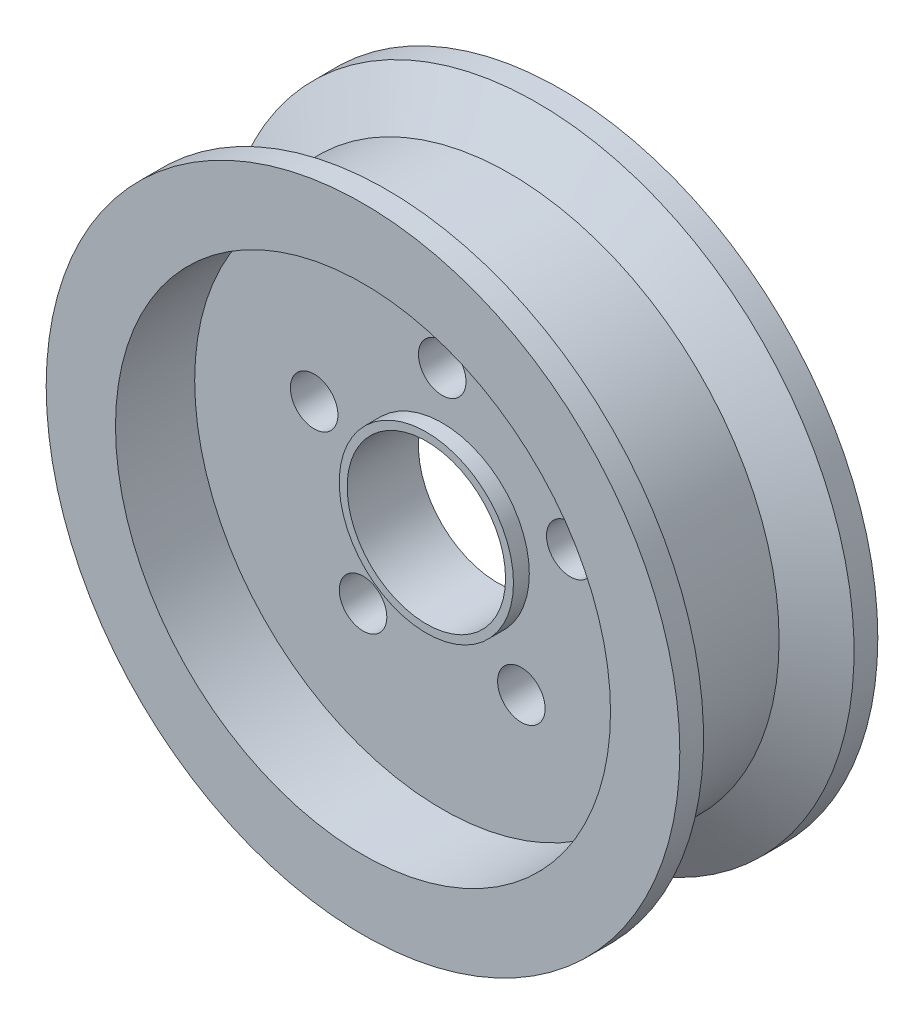
ISO-10303-21;
HEADER;
FILE_DESCRIPTION(('STEP AP214'),'2;1');
FILE_NAME('part.step','',(''),(''),'','','');
FILE_SCHEMA(('AUTOMOTIVE_DESIGN { 1 0 10303 214 1 1 1 1 }'));
ENDSEC;
DATA;
#1=APPLICATION_CONTEXT('core data for automotive mechanical design processes');
#2=APPLICATION_PROTOCOL_DEFINITION('international standard','automotive_design',2000,#1);
#3=PRODUCT_CONTEXT('',#1,'mechanical');
#4=PRODUCT('Part','Part','',(#3));
#5=PRODUCT_RELATED_PRODUCT_CATEGORY('part','',(#4));
#6=PRODUCT_DEFINITION_FORMATION('','',#4);
#7=PRODUCT_DEFINITION_CONTEXT('part definition',#1,'design');
#8=PRODUCT_DEFINITION('design','',#6,#7);
#9=PRODUCT_DEFINITION_SHAPE('','',#8);
#10=(LENGTH_UNIT() NAMED_UNIT(*) SI_UNIT(.MILLI.,.METRE.));
#11=(NAMED_UNIT(*) PLANE_ANGLE_UNIT() SI_UNIT($,.RADIAN.));
#12=(NAMED_UNIT(*) SI_UNIT($,.STERADIAN.) SOLID_ANGLE_UNIT());
#13=UNCERTAINTY_MEASURE_WITH_UNIT(LENGTH_MEASURE(1.E-05),#10,'distance_accuracy_value','');
#14=(GEOMETRIC_REPRESENTATION_CONTEXT(3) GLOBAL_UNCERTAINTY_ASSIGNED_CONTEXT((#13)) GLOBAL_UNIT_ASSIGNED_CONTEXT((#10,
#11,#12)) REPRESENTATION_CONTEXT('',''));
#15=CARTESIAN_POINT('',(0.,0.,0.));
#16=DIRECTION('',(0.,0.,1.));
#17=DIRECTION('',(1.,0.,0.));
#18=AXIS2_PLACEMENT_3D('',#15,#16,#17);
#19=CARTESIAN_POINT('',(0.,0.,12.5));
#20=DIRECTION('',(0.,0.,-1.));
#21=DIRECTION('',(-1.,0.,0.));
#22=AXIS2_PLACEMENT_3D('',#19,#20,#21);
#23=CYLINDRICAL_SURFACE('',#22,40.);
#24=CARTESIAN_POINT('',(0.,0.,-12.5));
#25=DIRECTION('',(0.,0.,1.));
#26=DIRECTION('',(1.,0.,0.));
#27=AXIS2_PLACEMENT_3D('',#24,#25,#26);
#28=CIRCLE('',#27,40.);
#29=CARTESIAN_POINT('',(40.,0.,-12.5));
#30=VERTEX_POINT('',#29);
#31=EDGE_CURVE('E45',#30,#30,#28,.T.);
#32=ORIENTED_EDGE('',*,*,#31,.T.);
#33=EDGE_LOOP('',(#32));
#34=FACE_BOUND('',#33,.T.);
#35=CARTESIAN_POINT('',(0.,0.,-9.5));
#36=DIRECTION('',(0.,0.,-1.));
#37=DIRECTION('',(-1.,0.,0.));
#38=AXIS2_PLACEMENT_3D('',#35,#36,#37);
#39=CIRCLE('',#38,40.);
#40=CARTESIAN_POINT('',(-40.,0.,-9.5));
#41=VERTEX_POINT('',#40);
#42=EDGE_CURVE('E128',#41,#41,#39,.T.);
#43=ORIENTED_EDGE('',*,*,#42,.T.);
#44=EDGE_LOOP('',(#43));
#45=FACE_BOUND('',#44,.T.);
#46=ADVANCED_FACE('F33',(#34,#45),#23,.T.);
#47=CARTESIAN_POINT('',(0.,0.,12.5));
#48=DIRECTION('',(0.,0.,1.));
#49=DIRECTION('',(1.,0.,0.));
#50=AXIS2_PLACEMENT_3D('',#47,#48,#49);
#51=CIRCLE('',#50,40.);
#52=CARTESIAN_POINT('',(40.,0.,12.5));
#53=VERTEX_POINT('',#52);
#54=EDGE_CURVE('E40',#53,#53,#51,.T.);
#55=ORIENTED_EDGE('',*,*,#54,.F.);
#56=EDGE_LOOP('',(#55));
#57=FACE_BOUND('',#56,.T.);
#58=CARTESIAN_POINT('',(0.,0.,9.5));
#59=DIRECTION('',(0.,0.,-1.));
#60=DIRECTION('',(-1.,0.,0.));
#61=AXIS2_PLACEMENT_3D('',#58,#59,#60);
#62=CIRCLE('',#61,40.);
#63=CARTESIAN_POINT('',(-40.,0.,9.5));
#64=VERTEX_POINT('',#63);
#65=EDGE_CURVE('E118',#64,#64,#62,.T.);
#66=ORIENTED_EDGE('',*,*,#65,.F.);
#67=EDGE_LOOP('',(#66));
#68=FACE_BOUND('',#67,.T.);
#69=ADVANCED_FACE('F112',(#57,#68),#23,.T.);
#70=CARTESIAN_POINT('',(0.,0.,12.5));
#71=DIRECTION('',(0.,0.,-1.));
#72=DIRECTION('',(-1.,0.,0.));
#73=AXIS2_PLACEMENT_3D('',#70,#71,#72);
#74=CYLINDRICAL_SURFACE('',#73,10.);
#75=CARTESIAN_POINT('',(0.,0.,4.5));
#76=DIRECTION('',(0.,0.,1.));
#77=DIRECTION('',(1.,0.,0.));
#78=AXIS2_PLACEMENT_3D('',#75,#76,#77);
#79=CIRCLE('',#78,10.);
#80=CARTESIAN_POINT('',(10.,0.,4.5));
#81=VERTEX_POINT('',#80);
#82=EDGE_CURVE('E84',#81,#81,#79,.T.);
#83=ORIENTED_EDGE('',*,*,#82,.T.);
#84=EDGE_LOOP('',(#83));
#85=FACE_BOUND('',#84,.T.);
#86=CARTESIAN_POINT('',(0.,0.,-4.5));
#87=DIRECTION('',(0.,0.,1.));
#88=DIRECTION('',(1.,0.,0.));
#89=AXIS2_PLACEMENT_3D('',#86,#87,#88);
#90=CIRCLE('',#89,10.);
#91=CARTESIAN_POINT('',(10.,0.,-4.5));
#92=VERTEX_POINT('',#91);
#93=EDGE_CURVE('E52',#92,#92,#90,.T.);
#94=ORIENTED_EDGE('',*,*,#93,.F.);
#95=EDGE_LOOP('',(#94));
#96=FACE_BOUND('',#95,.T.);
#97=ADVANCED_FACE('F115',(#85,#96),#74,.F.);
#98=CARTESIAN_POINT('',(0.,0.,2.5));
#99=DIRECTION('',(0.,0.,1.));
#100=DIRECTION('',(1.,0.,0.));
#101=AXIS2_PLACEMENT_3D('',#98,#99,#100);
#102=PLANE('',#101);
#103=CARTESIAN_POINT('',(16.1679607770176,5.25328890437406,2.5));
#104=DIRECTION('',(0.,0.,1.));
#105=DIRECTION('',(0.309016994374945,-0.951056516295155,0.));
#106=AXIS2_PLACEMENT_3D('',#103,#104,#105);
#107=CIRCLE('',#106,3.);
#108=CARTESIAN_POINT('',(19.1679607770176,5.25328890437406,2.5));
#109=VERTEX_POINT('',#108);
#110=EDGE_CURVE('E58',#109,#109,#107,.T.);
#111=ORIENTED_EDGE('',*,*,#110,.F.);
#112=EDGE_LOOP('',(#111));
#113=FACE_BOUND('',#112,.T.);
#114=CARTESIAN_POINT('',(9.99234928897197,-13.7532889043742,2.5));
#115=DIRECTION('',(0.,0.,1.));
#116=DIRECTION('',(-0.809016994374951,-0.587785252292469,0.));
#117=AXIS2_PLACEMENT_3D('',#114,#115,#116);
#118=CIRCLE('',#117,3.);
#119=CARTESIAN_POINT('',(12.992349288972,-13.7532889043742,2.5));
#120=VERTEX_POINT('',#119);
#121=EDGE_CURVE('E133',#120,#120,#118,.T.);
#122=ORIENTED_EDGE('',*,*,#121,.F.);
#123=EDGE_LOOP('',(#122));
#124=FACE_BOUND('',#123,.T.);
#125=CARTESIAN_POINT('',(-9.99234928897216,-13.753288904374,2.5));
#126=DIRECTION('',(0.,0.,1.));
#127=DIRECTION('',(-0.809016994374942,0.58778525229248,0.));
#128=AXIS2_PLACEMENT_3D('',#125,#126,#127);
#129=CIRCLE('',#128,3.);
#130=CARTESIAN_POINT('',(-6.99234928897217,-13.753288904374,2.5));
#131=VERTEX_POINT('',#130);
#132=EDGE_CURVE('E135',#131,#131,#129,.T.);
#133=ORIENTED_EDGE('',*,*,#132,.F.);
#134=EDGE_LOOP('',(#133));
#135=FACE_BOUND('',#134,.T.);
#136=CARTESIAN_POINT('',(-16.1679607770176,5.25328890437429,2.5));
#137=DIRECTION('',(0.,0.,1.));
#138=DIRECTION('',(0.309016994374958,0.95105651629515,0.));
#139=AXIS2_PLACEMENT_3D('',#136,#137,#138);
#140=CIRCLE('',#139,3.);
#141=CARTESIAN_POINT('',(-13.1679607770176,5.25328890437429,2.5));
#142=VERTEX_POINT('',#141);
#143=EDGE_CURVE('E73',#142,#142,#140,.T.);
#144=ORIENTED_EDGE('',*,*,#143,.F.);
#145=EDGE_LOOP('',(#144));
#146=FACE_BOUND('',#145,.T.);
#147=CARTESIAN_POINT('',(0.,17.,2.5));
#148=DIRECTION('',(0.,0.,1.));
#149=DIRECTION('',(1.,0.,0.));
#150=AXIS2_PLACEMENT_3D('',#147,#148,#149);
#151=CIRCLE('',#150,3.);
#152=CARTESIAN_POINT('',(3.,17.,2.5));
#153=VERTEX_POINT('',#152);
#154=EDGE_CURVE('E53',#153,#153,#151,.T.);
#155=ORIENTED_EDGE('',*,*,#154,.F.);
#156=EDGE_LOOP('',(#155));
#157=FACE_BOUND('',#156,.T.);
#158=CARTESIAN_POINT('',(0.,0.,2.5));
#159=DIRECTION('',(0.,0.,1.));
#160=DIRECTION('',(1.,0.,0.));
#161=AXIS2_PLACEMENT_3D('',#158,#159,#160);
#162=CIRCLE('',#161,31.25);
#163=CARTESIAN_POINT('',(31.25,0.,2.5));
#164=VERTEX_POINT('',#163);
#165=EDGE_CURVE('E96',#164,#164,#162,.T.);
#166=ORIENTED_EDGE('',*,*,#165,.T.);
#167=EDGE_LOOP('',(#166));
#168=FACE_BOUND('',#167,.T.);
#169=CARTESIAN_POINT('',(0.,0.,2.5));
#170=DIRECTION('',(0.,0.,1.));
#171=DIRECTION('',(1.,0.,0.));
#172=AXIS2_PLACEMENT_3D('',#169,#170,#171);
#173=CIRCLE('',#172,11.);
#174=CARTESIAN_POINT('',(11.,0.,2.5));
#175=VERTEX_POINT('',#174);
#176=EDGE_CURVE('E89',#175,#175,#173,.T.);
#177=ORIENTED_EDGE('',*,*,#176,.F.);
#178=EDGE_LOOP('',(#177));
#179=FACE_BOUND('',#178,.T.);
#180=ADVANCED_FACE('F108',(#113,#124,#135,#146,#157,#168,#179),#102,.T.);
#181=CARTESIAN_POINT('',(0.,0.,12.5));
#182=DIRECTION('',(0.,0.,1.));
#183=DIRECTION('',(1.,0.,0.));
#184=AXIS2_PLACEMENT_3D('',#181,#182,#183);
#185=PLANE('',#184);
#186=CARTESIAN_POINT('',(0.,0.,12.5));
#187=DIRECTION('',(0.,0.,1.));
#188=DIRECTION('',(1.,0.,0.));
#189=AXIS2_PLACEMENT_3D('',#186,#187,#188);
#190=CIRCLE('',#189,31.25);
#191=CARTESIAN_POINT('',(31.25,0.,12.5));
#192=VERTEX_POINT('',#191);
#193=EDGE_CURVE('E93',#192,#192,#190,.T.);
#194=ORIENTED_EDGE('',*,*,#193,.F.);
#195=EDGE_LOOP('',(#194));
#196=FACE_BOUND('',#195,.T.);
#197=ORIENTED_EDGE('',*,*,#54,.T.);
#198=EDGE_LOOP('',(#197));
#199=FACE_BOUND('',#198,.T.);
#200=ADVANCED_FACE('F104',(#196,#199),#185,.T.);
#201=CARTESIAN_POINT('',(0.,0.,-12.5));
#202=DIRECTION('',(0.,0.,1.));
#203=DIRECTION('',(1.,0.,0.));
#204=AXIS2_PLACEMENT_3D('',#201,#202,#203);
#205=PLANE('',#204);
#206=CARTESIAN_POINT('',(0.,0.,-12.5));
#207=DIRECTION('',(0.,0.,1.));
#208=DIRECTION('',(1.,0.,0.));
#209=AXIS2_PLACEMENT_3D('',#206,#207,#208);
#210=CIRCLE('',#209,31.25);
#211=CARTESIAN_POINT('',(31.25,0.,-12.5));
#212=VERTEX_POINT('',#211);
#213=EDGE_CURVE('E80',#212,#212,#210,.T.);
#214=ORIENTED_EDGE('',*,*,#213,.T.);
#215=EDGE_LOOP('',(#214));
#216=FACE_BOUND('',#215,.T.);
#217=ORIENTED_EDGE('',*,*,#31,.F.);
#218=EDGE_LOOP('',(#217));
#219=FACE_BOUND('',#218,.T.);
#220=ADVANCED_FACE('F107',(#216,#219),#205,.F.);
#221=CARTESIAN_POINT('',(0.,0.,2.5));
#222=DIRECTION('',(0.,0.,1.));
#223=DIRECTION('',(1.,0.,0.));
#224=AXIS2_PLACEMENT_3D('',#221,#222,#223);
#225=CYLINDRICAL_SURFACE('',#224,31.25);
#226=ORIENTED_EDGE('',*,*,#165,.F.);
#227=EDGE_LOOP('',(#226));
#228=FACE_BOUND('',#227,.T.);
#229=ORIENTED_EDGE('',*,*,#193,.T.);
#230=EDGE_LOOP('',(#229));
#231=FACE_BOUND('',#230,.T.);
#232=ADVANCED_FACE('F102',(#228,#231),#225,.F.);
#233=CARTESIAN_POINT('',(0.,0.,4.5));
#234=DIRECTION('',(0.,0.,1.));
#235=DIRECTION('',(1.,0.,0.));
#236=AXIS2_PLACEMENT_3D('',#233,#234,#235);
#237=PLANE('',#236);
#238=CARTESIAN_POINT('',(0.,0.,4.5));
#239=DIRECTION('',(0.,0.,1.));
#240=DIRECTION('',(1.,0.,0.));
#241=AXIS2_PLACEMENT_3D('',#238,#239,#240);
#242=CIRCLE('',#241,11.);
#243=CARTESIAN_POINT('',(11.,0.,4.5));
#244=VERTEX_POINT('',#243);
#245=EDGE_CURVE('E90',#244,#244,#242,.T.);
#246=ORIENTED_EDGE('',*,*,#245,.T.);
#247=EDGE_LOOP('',(#246));
#248=FACE_BOUND('',#247,.T.);
#249=ORIENTED_EDGE('',*,*,#82,.F.);
#250=EDGE_LOOP('',(#249));
#251=FACE_BOUND('',#250,.T.);
#252=ADVANCED_FACE('F156',(#248,#251),#237,.T.);
#253=CARTESIAN_POINT('',(0.,0.,4.5));
#254=DIRECTION('',(0.,0.,-1.));
#255=DIRECTION('',(-1.,0.,0.));
#256=AXIS2_PLACEMENT_3D('',#253,#254,#255);
#257=CYLINDRICAL_SURFACE('',#256,11.);
#258=ORIENTED_EDGE('',*,*,#245,.F.);
#259=EDGE_LOOP('',(#258));
#260=FACE_BOUND('',#259,.T.);
#261=ORIENTED_EDGE('',*,*,#176,.T.);
#262=EDGE_LOOP('',(#261));
#263=FACE_BOUND('',#262,.T.);
#264=ADVANCED_FACE('F153',(#260,#263),#257,.T.);
#265=CARTESIAN_POINT('',(0.,0.,-2.5));
#266=DIRECTION('',(0.,0.,-1.));
#267=DIRECTION('',(-1.,0.,0.));
#268=AXIS2_PLACEMENT_3D('',#265,#266,#267);
#269=CYLINDRICAL_SURFACE('',#268,31.25);
#270=CARTESIAN_POINT('',(0.,0.,-2.5));
#271=DIRECTION('',(0.,0.,1.));
#272=DIRECTION('',(1.,0.,0.));
#273=AXIS2_PLACEMENT_3D('',#270,#271,#272);
#274=CIRCLE('',#273,31.25);
#275=CARTESIAN_POINT('',(31.25,0.,-2.5));
#276=VERTEX_POINT('',#275);
#277=EDGE_CURVE('E81',#276,#276,#274,.T.);
#278=ORIENTED_EDGE('',*,*,#277,.T.);
#279=EDGE_LOOP('',(#278));
#280=FACE_BOUND('',#279,.T.);
#281=ORIENTED_EDGE('',*,*,#213,.F.);
#282=EDGE_LOOP('',(#281));
#283=FACE_BOUND('',#282,.T.);
#284=ADVANCED_FACE('F155',(#280,#283),#269,.F.);
#285=CARTESIAN_POINT('',(0.,0.,-2.5));
#286=DIRECTION('',(0.,0.,-1.));
#287=DIRECTION('',(1.,0.,0.));
#288=AXIS2_PLACEMENT_3D('',#285,#286,#287);
#289=PLANE('',#288);
#290=CARTESIAN_POINT('',(16.1679607770176,5.25328890437406,-2.5));
#291=DIRECTION('',(0.,0.,-1.));
#292=DIRECTION('',(-1.,0.,0.));
#293=AXIS2_PLACEMENT_3D('',#290,#291,#292);
#294=CIRCLE('',#293,3.);
#295=CARTESIAN_POINT('',(19.1679607770176,5.25328890437406,-2.5));
#296=VERTEX_POINT('',#295);
#297=EDGE_CURVE('E36',#296,#296,#294,.T.);
#298=ORIENTED_EDGE('',*,*,#297,.F.);
#299=EDGE_LOOP('',(#298));
#300=FACE_BOUND('',#299,.T.);
#301=CARTESIAN_POINT('',(9.99234928897197,-13.7532889043742,-2.5));
#302=DIRECTION('',(0.,0.,-1.));
#303=DIRECTION('',(-1.,0.,0.));
#304=AXIS2_PLACEMENT_3D('',#301,#302,#303);
#305=CIRCLE('',#304,3.);
#306=CARTESIAN_POINT('',(12.992349288972,-13.7532889043742,-2.5));
#307=VERTEX_POINT('',#306);
#308=EDGE_CURVE('E60',#307,#307,#305,.T.);
#309=ORIENTED_EDGE('',*,*,#308,.F.);
#310=EDGE_LOOP('',(#309));
#311=FACE_BOUND('',#310,.T.);
#312=CARTESIAN_POINT('',(-9.99234928897216,-13.753288904374,-2.5));
#313=DIRECTION('',(0.,0.,-1.));
#314=DIRECTION('',(-1.,0.,0.));
#315=AXIS2_PLACEMENT_3D('',#312,#313,#314);
#316=CIRCLE('',#315,3.);
#317=CARTESIAN_POINT('',(-6.99234928897217,-13.753288904374,-2.5));
#318=VERTEX_POINT('',#317);
#319=EDGE_CURVE('E57',#318,#318,#316,.T.);
#320=ORIENTED_EDGE('',*,*,#319,.F.);
#321=EDGE_LOOP('',(#320));
#322=FACE_BOUND('',#321,.T.);
#323=CARTESIAN_POINT('',(-16.1679607770176,5.25328890437429,-2.5));
#324=DIRECTION('',(0.,0.,-1.));
#325=DIRECTION('',(-1.,0.,0.));
#326=AXIS2_PLACEMENT_3D('',#323,#324,#325);
#327=CIRCLE('',#326,3.);
#328=CARTESIAN_POINT('',(-13.1679607770176,5.25328890437429,-2.5));
#329=VERTEX_POINT('',#328);
#330=EDGE_CURVE('E54',#329,#329,#327,.T.);
#331=ORIENTED_EDGE('',*,*,#330,.F.);
#332=EDGE_LOOP('',(#331));
#333=FACE_BOUND('',#332,.T.);
#334=CARTESIAN_POINT('',(0.,17.,-2.5));
#335=DIRECTION('',(0.,0.,-1.));
#336=DIRECTION('',(-1.,0.,0.));
#337=AXIS2_PLACEMENT_3D('',#334,#335,#336);
#338=CIRCLE('',#337,3.);
#339=CARTESIAN_POINT('',(3.,17.,-2.5));
#340=VERTEX_POINT('',#339);
#341=EDGE_CURVE('E49',#340,#340,#338,.T.);
#342=ORIENTED_EDGE('',*,*,#341,.F.);
#343=EDGE_LOOP('',(#342));
#344=FACE_BOUND('',#343,.T.);
#345=CARTESIAN_POINT('',(0.,0.,-2.5));
#346=DIRECTION('',(0.,0.,-1.));
#347=DIRECTION('',(-1.,0.,0.));
#348=AXIS2_PLACEMENT_3D('',#345,#346,#347);
#349=CIRCLE('',#348,11.);
#350=CARTESIAN_POINT('',(-11.,0.,-2.5));
#351=VERTEX_POINT('',#350);
#352=EDGE_CURVE('E10',#351,#351,#349,.T.);
#353=ORIENTED_EDGE('',*,*,#352,.F.);
#354=EDGE_LOOP('',(#353));
#355=FACE_BOUND('',#354,.T.);
#356=ORIENTED_EDGE('',*,*,#277,.F.);
#357=EDGE_LOOP('',(#356));
#358=FACE_BOUND('',#357,.T.);
#359=ADVANCED_FACE('F163',(#300,#311,#322,#333,#344,#355,#358),#289,.T.);
#360=CARTESIAN_POINT('',(0.,0.,-4.5));
#361=DIRECTION('',(0.,0.,1.));
#362=DIRECTION('',(1.,0.,0.));
#363=AXIS2_PLACEMENT_3D('',#360,#361,#362);
#364=CYLINDRICAL_SURFACE('',#363,11.);
#365=CARTESIAN_POINT('',(0.,0.,-4.5));
#366=DIRECTION('',(0.,0.,1.));
#367=DIRECTION('',(1.,0.,0.));
#368=AXIS2_PLACEMENT_3D('',#365,#366,#367);
#369=CIRCLE('',#368,11.);
#370=CARTESIAN_POINT('',(11.,0.,-4.5));
#371=VERTEX_POINT('',#370);
#372=EDGE_CURVE('E77',#371,#371,#369,.T.);
#373=ORIENTED_EDGE('',*,*,#372,.T.);
#374=EDGE_LOOP('',(#373));
#375=FACE_BOUND('',#374,.T.);
#376=ORIENTED_EDGE('',*,*,#352,.T.);
#377=EDGE_LOOP('',(#376));
#378=FACE_BOUND('',#377,.T.);
#379=ADVANCED_FACE('F211',(#375,#378),#364,.T.);
#380=CARTESIAN_POINT('',(0.,0.,-4.5));
#381=DIRECTION('',(0.,0.,-1.));
#382=DIRECTION('',(1.,0.,0.));
#383=AXIS2_PLACEMENT_3D('',#380,#381,#382);
#384=PLANE('',#383);
#385=ORIENTED_EDGE('',*,*,#93,.T.);
#386=EDGE_LOOP('',(#385));
#387=FACE_BOUND('',#386,.T.);
#388=ORIENTED_EDGE('',*,*,#372,.F.);
#389=EDGE_LOOP('',(#388));
#390=FACE_BOUND('',#389,.T.);
#391=ADVANCED_FACE('F207',(#387,#390),#384,.T.);
#392=CARTESIAN_POINT('',(0.,17.,-12.5));
#393=DIRECTION('',(0.,0.,1.));
#394=DIRECTION('',(1.,0.,0.));
#395=AXIS2_PLACEMENT_3D('',#392,#393,#394);
#396=CYLINDRICAL_SURFACE('',#395,3.);
#397=CARTESIAN_POINT('',(3.,17.,-2.5));
#398=CARTESIAN_POINT('',(3.,17.,-2.44791666666667));
#399=CARTESIAN_POINT('',(3.,17.,-2.39583333333333));
#400=CARTESIAN_POINT('',(3.,17.,-2.29166666666667));
#401=CARTESIAN_POINT('',(3.,17.,-2.23958333333333));
#402=CARTESIAN_POINT('',(3.,17.,-2.13541666666667));
#403=CARTESIAN_POINT('',(3.,17.,-2.08333333333333));
#404=CARTESIAN_POINT('',(3.,17.,-1.97916666666667));
#405=CARTESIAN_POINT('',(3.,17.,-1.92708333333333));
#406=CARTESIAN_POINT('',(3.,17.,-1.82291666666667));
#407=CARTESIAN_POINT('',(3.,17.,-1.77083333333333));
#408=CARTESIAN_POINT('',(3.,17.,-1.66666666666667));
#409=CARTESIAN_POINT('',(3.,17.,-1.61458333333333));
#410=CARTESIAN_POINT('',(3.,17.,-1.51041666666667));
#411=CARTESIAN_POINT('',(3.,17.,-1.45833333333333));
#412=CARTESIAN_POINT('',(3.,17.,-1.35416666666667));
#413=CARTESIAN_POINT('',(3.,17.,-1.30208333333333));
#414=CARTESIAN_POINT('',(3.,17.,-1.19791666666667));
#415=CARTESIAN_POINT('',(3.,17.,-1.14583333333333));
#416=CARTESIAN_POINT('',(3.,17.,-1.04166666666667));
#417=CARTESIAN_POINT('',(3.,17.,-0.989583333333334));
#418=CARTESIAN_POINT('',(3.,17.,-0.885416666666668));
#419=CARTESIAN_POINT('',(3.,17.,-0.833333333333334));
#420=CARTESIAN_POINT('',(3.,17.,-0.729166666666667));
#421=CARTESIAN_POINT('',(3.,17.,-0.677083333333334));
#422=CARTESIAN_POINT('',(3.,17.,-0.572916666666667));
#423=CARTESIAN_POINT('',(3.,17.,-0.520833333333334));
#424=CARTESIAN_POINT('',(3.,17.,-0.416666666666667));
#425=CARTESIAN_POINT('',(3.,17.,-0.364583333333334));
#426=CARTESIAN_POINT('',(3.,17.,-0.260416666666667));
#427=CARTESIAN_POINT('',(3.,17.,-0.208333333333334));
#428=CARTESIAN_POINT('',(3.,17.,-0.104166666666667));
#429=CARTESIAN_POINT('',(3.,17.,-0.0520833333333334));
#430=CARTESIAN_POINT('',(3.,17.,0.0520833333333334));
#431=CARTESIAN_POINT('',(3.,17.,0.104166666666667));
#432=CARTESIAN_POINT('',(3.,17.,0.208333333333334));
#433=CARTESIAN_POINT('',(3.,17.,0.260416666666667));
#434=CARTESIAN_POINT('',(3.,17.,0.364583333333334));
#435=CARTESIAN_POINT('',(3.,17.,0.416666666666667));
#436=CARTESIAN_POINT('',(3.,17.,0.520833333333334));
#437=CARTESIAN_POINT('',(3.,17.,0.572916666666667));
#438=CARTESIAN_POINT('',(3.,17.,0.677083333333334));
#439=CARTESIAN_POINT('',(3.,17.,0.729166666666667));
#440=CARTESIAN_POINT('',(3.,17.,0.833333333333333));
#441=CARTESIAN_POINT('',(3.,17.,0.885416666666666));
#442=CARTESIAN_POINT('',(3.,17.,0.989583333333333));
#443=CARTESIAN_POINT('',(3.,17.,1.04166666666667));
#444=CARTESIAN_POINT('',(3.,17.,1.14583333333333));
#445=CARTESIAN_POINT('',(3.,17.,1.19791666666667));
#446=CARTESIAN_POINT('',(3.,17.,1.30208333333333));
#447=CARTESIAN_POINT('',(3.,17.,1.35416666666667));
#448=CARTESIAN_POINT('',(3.,17.,1.45833333333333));
#449=CARTESIAN_POINT('',(3.,17.,1.51041666666667));
#450=CARTESIAN_POINT('',(3.,17.,1.61458333333333));
#451=CARTESIAN_POINT('',(3.,17.,1.66666666666667));
#452=CARTESIAN_POINT('',(3.,17.,1.77083333333333));
#453=CARTESIAN_POINT('',(3.,17.,1.82291666666667));
#454=CARTESIAN_POINT('',(3.,17.,1.92708333333333));
#455=CARTESIAN_POINT('',(3.,17.,1.97916666666667));
#456=CARTESIAN_POINT('',(3.,17.,2.08333333333333));
#457=CARTESIAN_POINT('',(3.,17.,2.13541666666667));
#458=CARTESIAN_POINT('',(3.,17.,2.23958333333333));
#459=CARTESIAN_POINT('',(3.,17.,2.29166666666667));
#460=CARTESIAN_POINT('',(3.,17.,2.39583333333333));
#461=CARTESIAN_POINT('',(3.,17.,2.44791666666667));
#462=CARTESIAN_POINT('',(3.,17.,2.5));
#463=B_SPLINE_CURVE_WITH_KNOTS('',3,(#397,#398,#399,#400,#401,#402,#403,#404,#405,#406,#407,
#408,#409,#410,#411,#412,#413,#414,#415,#416,#417,#418,#419,#420,#421,#422,#423,#424,#425,#426,
#427,#428,#429,#430,#431,#432,#433,#434,#435,#436,#437,#438,#439,#440,#441,#442,#443,#444,#445,
#446,#447,#448,#449,#450,#451,#452,#453,#454,#455,#456,#457,#458,#459,#460,#461,#462),
.UNSPECIFIED.,.F.,.F.,(4,2,2,2,2,2,2,2,2,2,2,2,2,2,2,2,2,2,2,2,2,2,2,2,2,2,2,2,2,2,2,2,4),(0.,
0.15625,0.3125,0.46875,0.625000000000001,0.781250000000001,0.937500000000001,1.09375,1.25,
1.40625,1.5625,1.71875,1.875,2.03125,2.1875,2.34375,2.5,2.65625,2.8125,2.96875,3.125,3.28125,
3.4375,3.59375,3.75,3.90625,4.0625,4.21875,4.375,4.53125,4.6875,4.84375,5.),.UNSPECIFIED.);
#464=EDGE_CURVE('BSEAM203',#340,#153,#463,.T.);
#465=ORIENTED_EDGE('',*,*,#341,.T.);
#466=ORIENTED_EDGE('',*,*,#154,.T.);
#467=ORIENTED_EDGE('',*,*,#464,.T.);
#468=ORIENTED_EDGE('',*,*,#464,.F.);
#469=EDGE_LOOP('',(#465,#467,#466,#468));
#470=FACE_BOUND('',#469,.T.);
#471=ADVANCED_FACE('F203',(#470),#396,.F.);
#472=CARTESIAN_POINT('',(-16.1679607770176,5.25328890437429,-12.5));
#473=DIRECTION('',(0.,0.,1.));
#474=DIRECTION('',(1.,0.,0.));
#475=AXIS2_PLACEMENT_3D('',#472,#473,#474);
#476=CYLINDRICAL_SURFACE('',#475,3.);
#477=CARTESIAN_POINT('',(-13.1679607770176,5.25328890437429,-2.5));
#478=CARTESIAN_POINT('',(-13.1679607770176,5.25328890437429,-2.44791666666667));
#479=CARTESIAN_POINT('',(-13.1679607770176,5.25328890437429,-2.39583333333333));
#480=CARTESIAN_POINT('',(-13.1679607770176,5.25328890437429,-2.29166666666667));
#481=CARTESIAN_POINT('',(-13.1679607770176,5.25328890437429,-2.23958333333333));
#482=CARTESIAN_POINT('',(-13.1679607770176,5.25328890437429,-2.13541666666667));
#483=CARTESIAN_POINT('',(-13.1679607770176,5.25328890437429,-2.08333333333333));
#484=CARTESIAN_POINT('',(-13.1679607770176,5.25328890437429,-1.97916666666667));
#485=CARTESIAN_POINT('',(-13.1679607770176,5.25328890437429,-1.92708333333333));
#486=CARTESIAN_POINT('',(-13.1679607770176,5.25328890437429,-1.82291666666667));
#487=CARTESIAN_POINT('',(-13.1679607770176,5.25328890437429,-1.77083333333333));
#488=CARTESIAN_POINT('',(-13.1679607770176,5.25328890437429,-1.66666666666667));
#489=CARTESIAN_POINT('',(-13.1679607770176,5.25328890437429,-1.61458333333333));
#490=CARTESIAN_POINT('',(-13.1679607770176,5.25328890437429,-1.51041666666667));
#491=CARTESIAN_POINT('',(-13.1679607770176,5.25328890437429,-1.45833333333333));
#492=CARTESIAN_POINT('',(-13.1679607770176,5.25328890437429,-1.35416666666667));
#493=CARTESIAN_POINT('',(-13.1679607770176,5.25328890437429,-1.30208333333333));
#494=CARTESIAN_POINT('',(-13.1679607770176,5.25328890437429,-1.19791666666667));
#495=CARTESIAN_POINT('',(-13.1679607770176,5.25328890437429,-1.14583333333333));
#496=CARTESIAN_POINT('',(-13.1679607770176,5.25328890437429,-1.04166666666667));
#497=CARTESIAN_POINT('',(-13.1679607770176,5.25328890437429,-0.989583333333334));
#498=CARTESIAN_POINT('',(-13.1679607770176,5.25328890437429,-0.885416666666668));
#499=CARTESIAN_POINT('',(-13.1679607770176,5.25328890437429,-0.833333333333334));
#500=CARTESIAN_POINT('',(-13.1679607770176,5.25328890437429,-0.729166666666667));
#501=CARTESIAN_POINT('',(-13.1679607770176,5.25328890437429,-0.677083333333334));
#502=CARTESIAN_POINT('',(-13.1679607770176,5.25328890437429,-0.572916666666667));
#503=CARTESIAN_POINT('',(-13.1679607770176,5.25328890437429,-0.520833333333334));
#504=CARTESIAN_POINT('',(-13.1679607770176,5.25328890437429,-0.416666666666667));
#505=CARTESIAN_POINT('',(-13.1679607770176,5.25328890437429,-0.364583333333334));
#506=CARTESIAN_POINT('',(-13.1679607770176,5.25328890437429,-0.260416666666667));
#507=CARTESIAN_POINT('',(-13.1679607770176,5.25328890437429,-0.208333333333334));
#508=CARTESIAN_POINT('',(-13.1679607770176,5.25328890437429,-0.104166666666667));
#509=CARTESIAN_POINT('',(-13.1679607770176,5.25328890437429,-0.0520833333333334));
#510=CARTESIAN_POINT('',(-13.1679607770176,5.25328890437429,0.0520833333333334));
#511=CARTESIAN_POINT('',(-13.1679607770176,5.25328890437429,0.104166666666667));
#512=CARTESIAN_POINT('',(-13.1679607770176,5.25328890437429,0.208333333333334));
#513=CARTESIAN_POINT('',(-13.1679607770176,5.25328890437429,0.260416666666667));
#514=CARTESIAN_POINT('',(-13.1679607770176,5.25328890437429,0.364583333333334));
#515=CARTESIAN_POINT('',(-13.1679607770176,5.25328890437429,0.416666666666667));
#516=CARTESIAN_POINT('',(-13.1679607770176,5.25328890437429,0.520833333333334));
#517=CARTESIAN_POINT('',(-13.1679607770176,5.25328890437429,0.572916666666667));
#518=CARTESIAN_POINT('',(-13.1679607770176,5.25328890437429,0.677083333333334));
#519=CARTESIAN_POINT('',(-13.1679607770176,5.25328890437429,0.729166666666667));
#520=CARTESIAN_POINT('',(-13.1679607770176,5.25328890437429,0.833333333333333));
#521=CARTESIAN_POINT('',(-13.1679607770176,5.25328890437429,0.885416666666666));
#522=CARTESIAN_POINT('',(-13.1679607770176,5.25328890437429,0.989583333333333));
#523=CARTESIAN_POINT('',(-13.1679607770176,5.25328890437429,1.04166666666667));
#524=CARTESIAN_POINT('',(-13.1679607770176,5.25328890437429,1.14583333333333));
#525=CARTESIAN_POINT('',(-13.1679607770176,5.25328890437429,1.19791666666667));
#526=CARTESIAN_POINT('',(-13.1679607770176,5.25328890437429,1.30208333333333));
#527=CARTESIAN_POINT('',(-13.1679607770176,5.25328890437429,1.35416666666667));
#528=CARTESIAN_POINT('',(-13.1679607770176,5.25328890437429,1.45833333333333));
#529=CARTESIAN_POINT('',(-13.1679607770176,5.25328890437429,1.51041666666667));
#530=CARTESIAN_POINT('',(-13.1679607770176,5.25328890437429,1.61458333333333));
#531=CARTESIAN_POINT('',(-13.1679607770176,5.25328890437429,1.66666666666667));
#532=CARTESIAN_POINT('',(-13.1679607770176,5.25328890437429,1.77083333333333));
#533=CARTESIAN_POINT('',(-13.1679607770176,5.25328890437429,1.82291666666667));
#534=CARTESIAN_POINT('',(-13.1679607770176,5.25328890437429,1.92708333333333));
#535=CARTESIAN_POINT('',(-13.1679607770176,5.25328890437429,1.97916666666667));
#536=CARTESIAN_POINT('',(-13.1679607770176,5.25328890437429,2.08333333333333));
#537=CARTESIAN_POINT('',(-13.1679607770176,5.25328890437429,2.13541666666667));
#538=CARTESIAN_POINT('',(-13.1679607770176,5.25328890437429,2.23958333333333));
#539=CARTESIAN_POINT('',(-13.1679607770176,5.25328890437429,2.29166666666667));
#540=CARTESIAN_POINT('',(-13.1679607770176,5.25328890437429,2.39583333333333));
#541=CARTESIAN_POINT('',(-13.1679607770176,5.25328890437429,2.44791666666667));
#542=CARTESIAN_POINT('',(-13.1679607770176,5.25328890437429,2.5));
#543=B_SPLINE_CURVE_WITH_KNOTS('',3,(#477,#478,#479,#480,#481,#482,#483,#484,#485,#486,#487,
#488,#489,#490,#491,#492,#493,#494,#495,#496,#497,#498,#499,#500,#501,#502,#503,#504,#505,#506,
#507,#508,#509,#510,#511,#512,#513,#514,#515,#516,#517,#518,#519,#520,#521,#522,#523,#524,#525,
#526,#527,#528,#529,#530,#531,#532,#533,#534,#535,#536,#537,#538,#539,#540,#541,#542),
.UNSPECIFIED.,.F.,.F.,(4,2,2,2,2,2,2,2,2,2,2,2,2,2,2,2,2,2,2,2,2,2,2,2,2,2,2,2,2,2,2,2,4),(0.,
0.15625,0.3125,0.46875,0.625000000000001,0.781250000000001,0.937500000000001,1.09375,1.25,
1.40625,1.5625,1.71875,1.875,2.03125,2.1875,2.34375,2.5,2.65625,2.8125,2.96875,3.125,3.28125,
3.4375,3.59375,3.75,3.90625,4.0625,4.21875,4.375,4.53125,4.6875,4.84375,5.),.UNSPECIFIED.);
#544=EDGE_CURVE('BSEAM142',#329,#142,#543,.T.);
#545=ORIENTED_EDGE('',*,*,#330,.T.);
#546=ORIENTED_EDGE('',*,*,#143,.T.);
#547=ORIENTED_EDGE('',*,*,#544,.T.);
#548=ORIENTED_EDGE('',*,*,#544,.F.);
#549=EDGE_LOOP('',(#545,#547,#546,#548));
#550=FACE_BOUND('',#549,.T.);
#551=ADVANCED_FACE('F142',(#550),#476,.F.);
#552=CARTESIAN_POINT('',(-9.99234928897216,-13.753288904374,-12.5));
#553=DIRECTION('',(0.,0.,1.));
#554=DIRECTION('',(1.,0.,0.));
#555=AXIS2_PLACEMENT_3D('',#552,#553,#554);
#556=CYLINDRICAL_SURFACE('',#555,3.);
#557=CARTESIAN_POINT('',(-6.99234928897217,-13.753288904374,-2.5));
#558=CARTESIAN_POINT('',(-6.99234928897217,-13.753288904374,-2.44791666666667));
#559=CARTESIAN_POINT('',(-6.99234928897217,-13.753288904374,-2.39583333333333));
#560=CARTESIAN_POINT('',(-6.99234928897217,-13.753288904374,-2.29166666666667));
#561=CARTESIAN_POINT('',(-6.99234928897217,-13.753288904374,-2.23958333333333));
#562=CARTESIAN_POINT('',(-6.99234928897217,-13.753288904374,-2.13541666666667));
#563=CARTESIAN_POINT('',(-6.99234928897217,-13.753288904374,-2.08333333333333));
#564=CARTESIAN_POINT('',(-6.99234928897217,-13.753288904374,-1.97916666666667));
#565=CARTESIAN_POINT('',(-6.99234928897217,-13.753288904374,-1.92708333333333));
#566=CARTESIAN_POINT('',(-6.99234928897217,-13.753288904374,-1.82291666666667));
#567=CARTESIAN_POINT('',(-6.99234928897217,-13.753288904374,-1.77083333333333));
#568=CARTESIAN_POINT('',(-6.99234928897217,-13.753288904374,-1.66666666666667));
#569=CARTESIAN_POINT('',(-6.99234928897217,-13.753288904374,-1.61458333333333));
#570=CARTESIAN_POINT('',(-6.99234928897217,-13.753288904374,-1.51041666666667));
#571=CARTESIAN_POINT('',(-6.99234928897217,-13.753288904374,-1.45833333333333));
#572=CARTESIAN_POINT('',(-6.99234928897217,-13.753288904374,-1.35416666666667));
#573=CARTESIAN_POINT('',(-6.99234928897217,-13.753288904374,-1.30208333333333));
#574=CARTESIAN_POINT('',(-6.99234928897217,-13.753288904374,-1.19791666666667));
#575=CARTESIAN_POINT('',(-6.99234928897217,-13.753288904374,-1.14583333333333));
#576=CARTESIAN_POINT('',(-6.99234928897217,-13.753288904374,-1.04166666666667));
#577=CARTESIAN_POINT('',(-6.99234928897217,-13.753288904374,-0.989583333333334));
#578=CARTESIAN_POINT('',(-6.99234928897217,-13.753288904374,-0.885416666666668));
#579=CARTESIAN_POINT('',(-6.99234928897217,-13.753288904374,-0.833333333333334));
#580=CARTESIAN_POINT('',(-6.99234928897217,-13.753288904374,-0.729166666666667));
#581=CARTESIAN_POINT('',(-6.99234928897217,-13.753288904374,-0.677083333333334));
#582=CARTESIAN_POINT('',(-6.99234928897217,-13.753288904374,-0.572916666666667));
#583=CARTESIAN_POINT('',(-6.99234928897217,-13.753288904374,-0.520833333333334));
#584=CARTESIAN_POINT('',(-6.99234928897217,-13.753288904374,-0.416666666666667));
#585=CARTESIAN_POINT('',(-6.99234928897217,-13.753288904374,-0.364583333333334));
#586=CARTESIAN_POINT('',(-6.99234928897217,-13.753288904374,-0.260416666666667));
#587=CARTESIAN_POINT('',(-6.99234928897217,-13.753288904374,-0.208333333333334));
#588=CARTESIAN_POINT('',(-6.99234928897217,-13.753288904374,-0.104166666666667));
#589=CARTESIAN_POINT('',(-6.99234928897217,-13.753288904374,-0.0520833333333334));
#590=CARTESIAN_POINT('',(-6.99234928897217,-13.753288904374,0.0520833333333334));
#591=CARTESIAN_POINT('',(-6.99234928897217,-13.753288904374,0.104166666666667));
#592=CARTESIAN_POINT('',(-6.99234928897217,-13.753288904374,0.208333333333334));
#593=CARTESIAN_POINT('',(-6.99234928897217,-13.753288904374,0.260416666666667));
#594=CARTESIAN_POINT('',(-6.99234928897217,-13.753288904374,0.364583333333334));
#595=CARTESIAN_POINT('',(-6.99234928897217,-13.753288904374,0.416666666666667));
#596=CARTESIAN_POINT('',(-6.99234928897217,-13.753288904374,0.520833333333334));
#597=CARTESIAN_POINT('',(-6.99234928897217,-13.753288904374,0.572916666666667));
#598=CARTESIAN_POINT('',(-6.99234928897217,-13.753288904374,0.677083333333334));
#599=CARTESIAN_POINT('',(-6.99234928897217,-13.753288904374,0.729166666666667));
#600=CARTESIAN_POINT('',(-6.99234928897217,-13.753288904374,0.833333333333333));
#601=CARTESIAN_POINT('',(-6.99234928897217,-13.753288904374,0.885416666666666));
#602=CARTESIAN_POINT('',(-6.99234928897217,-13.753288904374,0.989583333333333));
#603=CARTESIAN_POINT('',(-6.99234928897217,-13.753288904374,1.04166666666667));
#604=CARTESIAN_POINT('',(-6.99234928897217,-13.753288904374,1.14583333333333));
#605=CARTESIAN_POINT('',(-6.99234928897217,-13.753288904374,1.19791666666667));
#606=CARTESIAN_POINT('',(-6.99234928897217,-13.753288904374,1.30208333333333));
#607=CARTESIAN_POINT('',(-6.99234928897217,-13.753288904374,1.35416666666667));
#608=CARTESIAN_POINT('',(-6.99234928897217,-13.753288904374,1.45833333333333));
#609=CARTESIAN_POINT('',(-6.99234928897217,-13.753288904374,1.51041666666667));
#610=CARTESIAN_POINT('',(-6.99234928897217,-13.753288904374,1.61458333333333));
#611=CARTESIAN_POINT('',(-6.99234928897217,-13.753288904374,1.66666666666667));
#612=CARTESIAN_POINT('',(-6.99234928897217,-13.753288904374,1.77083333333333));
#613=CARTESIAN_POINT('',(-6.99234928897217,-13.753288904374,1.82291666666667));
#614=CARTESIAN_POINT('',(-6.99234928897217,-13.753288904374,1.92708333333333));
#615=CARTESIAN_POINT('',(-6.99234928897217,-13.753288904374,1.97916666666667));
#616=CARTESIAN_POINT('',(-6.99234928897217,-13.753288904374,2.08333333333333));
#617=CARTESIAN_POINT('',(-6.99234928897217,-13.753288904374,2.13541666666667));
#618=CARTESIAN_POINT('',(-6.99234928897217,-13.753288904374,2.23958333333333));
#619=CARTESIAN_POINT('',(-6.99234928897217,-13.753288904374,2.29166666666667));
#620=CARTESIAN_POINT('',(-6.99234928897217,-13.753288904374,2.39583333333333));
#621=CARTESIAN_POINT('',(-6.99234928897217,-13.753288904374,2.44791666666667));
#622=CARTESIAN_POINT('',(-6.99234928897217,-13.753288904374,2.5));
#623=B_SPLINE_CURVE_WITH_KNOTS('',3,(#557,#558,#559,#560,#561,#562,#563,#564,#565,#566,#567,
#568,#569,#570,#571,#572,#573,#574,#575,#576,#577,#578,#579,#580,#581,#582,#583,#584,#585,#586,
#587,#588,#589,#590,#591,#592,#593,#594,#595,#596,#597,#598,#599,#600,#601,#602,#603,#604,#605,
#606,#607,#608,#609,#610,#611,#612,#613,#614,#615,#616,#617,#618,#619,#620,#621,#622),
.UNSPECIFIED.,.F.,.F.,(4,2,2,2,2,2,2,2,2,2,2,2,2,2,2,2,2,2,2,2,2,2,2,2,2,2,2,2,2,2,2,2,4),(0.,
0.15625,0.3125,0.46875,0.625000000000001,0.781250000000001,0.937500000000001,1.09375,1.25,
1.40625,1.5625,1.71875,1.875,2.03125,2.1875,2.34375,2.5,2.65625,2.8125,2.96875,3.125,3.28125,
3.4375,3.59375,3.75,3.90625,4.0625,4.21875,4.375,4.53125,4.6875,4.84375,5.),.UNSPECIFIED.);
#624=EDGE_CURVE('BSEAM197',#318,#131,#623,.T.);
#625=ORIENTED_EDGE('',*,*,#319,.T.);
#626=ORIENTED_EDGE('',*,*,#132,.T.);
#627=ORIENTED_EDGE('',*,*,#624,.T.);
#628=ORIENTED_EDGE('',*,*,#624,.F.);
#629=EDGE_LOOP('',(#625,#627,#626,#628));
#630=FACE_BOUND('',#629,.T.);
#631=ADVANCED_FACE('F197',(#630),#556,.F.);
#632=CARTESIAN_POINT('',(9.99234928897197,-13.7532889043742,-12.5));
#633=DIRECTION('',(0.,0.,1.));
#634=DIRECTION('',(1.,0.,0.));
#635=AXIS2_PLACEMENT_3D('',#632,#633,#634);
#636=CYLINDRICAL_SURFACE('',#635,3.);
#637=CARTESIAN_POINT('',(12.992349288972,-13.7532889043742,-2.5));
#638=CARTESIAN_POINT('',(12.992349288972,-13.7532889043742,-2.44791666666667));
#639=CARTESIAN_POINT('',(12.992349288972,-13.7532889043742,-2.39583333333333));
#640=CARTESIAN_POINT('',(12.992349288972,-13.7532889043742,-2.29166666666667));
#641=CARTESIAN_POINT('',(12.992349288972,-13.7532889043742,-2.23958333333333));
#642=CARTESIAN_POINT('',(12.992349288972,-13.7532889043742,-2.13541666666667));
#643=CARTESIAN_POINT('',(12.992349288972,-13.7532889043742,-2.08333333333333));
#644=CARTESIAN_POINT('',(12.992349288972,-13.7532889043742,-1.97916666666667));
#645=CARTESIAN_POINT('',(12.992349288972,-13.7532889043742,-1.92708333333333));
#646=CARTESIAN_POINT('',(12.992349288972,-13.7532889043742,-1.82291666666667));
#647=CARTESIAN_POINT('',(12.992349288972,-13.7532889043742,-1.77083333333333));
#648=CARTESIAN_POINT('',(12.992349288972,-13.7532889043742,-1.66666666666667));
#649=CARTESIAN_POINT('',(12.992349288972,-13.7532889043742,-1.61458333333333));
#650=CARTESIAN_POINT('',(12.992349288972,-13.7532889043742,-1.51041666666667));
#651=CARTESIAN_POINT('',(12.992349288972,-13.7532889043742,-1.45833333333333));
#652=CARTESIAN_POINT('',(12.992349288972,-13.7532889043742,-1.35416666666667));
#653=CARTESIAN_POINT('',(12.992349288972,-13.7532889043742,-1.30208333333333));
#654=CARTESIAN_POINT('',(12.992349288972,-13.7532889043742,-1.19791666666667));
#655=CARTESIAN_POINT('',(12.992349288972,-13.7532889043742,-1.14583333333333));
#656=CARTESIAN_POINT('',(12.992349288972,-13.7532889043742,-1.04166666666667));
#657=CARTESIAN_POINT('',(12.992349288972,-13.7532889043742,-0.989583333333334));
#658=CARTESIAN_POINT('',(12.992349288972,-13.7532889043742,-0.885416666666668));
#659=CARTESIAN_POINT('',(12.992349288972,-13.7532889043742,-0.833333333333334));
#660=CARTESIAN_POINT('',(12.992349288972,-13.7532889043742,-0.729166666666667));
#661=CARTESIAN_POINT('',(12.992349288972,-13.7532889043742,-0.677083333333334));
#662=CARTESIAN_POINT('',(12.992349288972,-13.7532889043742,-0.572916666666667));
#663=CARTESIAN_POINT('',(12.992349288972,-13.7532889043742,-0.520833333333334));
#664=CARTESIAN_POINT('',(12.992349288972,-13.7532889043742,-0.416666666666667));
#665=CARTESIAN_POINT('',(12.992349288972,-13.7532889043742,-0.364583333333334));
#666=CARTESIAN_POINT('',(12.992349288972,-13.7532889043742,-0.260416666666667));
#667=CARTESIAN_POINT('',(12.992349288972,-13.7532889043742,-0.208333333333334));
#668=CARTESIAN_POINT('',(12.992349288972,-13.7532889043742,-0.104166666666667));
#669=CARTESIAN_POINT('',(12.992349288972,-13.7532889043742,-0.0520833333333334));
#670=CARTESIAN_POINT('',(12.992349288972,-13.7532889043742,0.0520833333333334));
#671=CARTESIAN_POINT('',(12.992349288972,-13.7532889043742,0.104166666666667));
#672=CARTESIAN_POINT('',(12.992349288972,-13.7532889043742,0.208333333333334));
#673=CARTESIAN_POINT('',(12.992349288972,-13.7532889043742,0.260416666666667));
#674=CARTESIAN_POINT('',(12.992349288972,-13.7532889043742,0.364583333333334));
#675=CARTESIAN_POINT('',(12.992349288972,-13.7532889043742,0.416666666666667));
#676=CARTESIAN_POINT('',(12.992349288972,-13.7532889043742,0.520833333333334));
#677=CARTESIAN_POINT('',(12.992349288972,-13.7532889043742,0.572916666666667));
#678=CARTESIAN_POINT('',(12.992349288972,-13.7532889043742,0.677083333333334));
#679=CARTESIAN_POINT('',(12.992349288972,-13.7532889043742,0.729166666666667));
#680=CARTESIAN_POINT('',(12.992349288972,-13.7532889043742,0.833333333333333));
#681=CARTESIAN_POINT('',(12.992349288972,-13.7532889043742,0.885416666666666));
#682=CARTESIAN_POINT('',(12.992349288972,-13.7532889043742,0.989583333333333));
#683=CARTESIAN_POINT('',(12.992349288972,-13.7532889043742,1.04166666666667));
#684=CARTESIAN_POINT('',(12.992349288972,-13.7532889043742,1.14583333333333));
#685=CARTESIAN_POINT('',(12.992349288972,-13.7532889043742,1.19791666666667));
#686=CARTESIAN_POINT('',(12.992349288972,-13.7532889043742,1.30208333333333));
#687=CARTESIAN_POINT('',(12.992349288972,-13.7532889043742,1.35416666666667));
#688=CARTESIAN_POINT('',(12.992349288972,-13.7532889043742,1.45833333333333));
#689=CARTESIAN_POINT('',(12.992349288972,-13.7532889043742,1.51041666666667));
#690=CARTESIAN_POINT('',(12.992349288972,-13.7532889043742,1.61458333333333));
#691=CARTESIAN_POINT('',(12.992349288972,-13.7532889043742,1.66666666666667));
#692=CARTESIAN_POINT('',(12.992349288972,-13.7532889043742,1.77083333333333));
#693=CARTESIAN_POINT('',(12.992349288972,-13.7532889043742,1.82291666666667));
#694=CARTESIAN_POINT('',(12.992349288972,-13.7532889043742,1.92708333333333));
#695=CARTESIAN_POINT('',(12.992349288972,-13.7532889043742,1.97916666666667));
#696=CARTESIAN_POINT('',(12.992349288972,-13.7532889043742,2.08333333333333));
#697=CARTESIAN_POINT('',(12.992349288972,-13.7532889043742,2.13541666666667));
#698=CARTESIAN_POINT('',(12.992349288972,-13.7532889043742,2.23958333333333));
#699=CARTESIAN_POINT('',(12.992349288972,-13.7532889043742,2.29166666666667));
#700=CARTESIAN_POINT('',(12.992349288972,-13.7532889043742,2.39583333333333));
#701=CARTESIAN_POINT('',(12.992349288972,-13.7532889043742,2.44791666666667));
#702=CARTESIAN_POINT('',(12.992349288972,-13.7532889043742,2.5));
#703=B_SPLINE_CURVE_WITH_KNOTS('',3,(#637,#638,#639,#640,#641,#642,#643,#644,#645,#646,#647,
#648,#649,#650,#651,#652,#653,#654,#655,#656,#657,#658,#659,#660,#661,#662,#663,#664,#665,#666,
#667,#668,#669,#670,#671,#672,#673,#674,#675,#676,#677,#678,#679,#680,#681,#682,#683,#684,#685,
#686,#687,#688,#689,#690,#691,#692,#693,#694,#695,#696,#697,#698,#699,#700,#701,#702),
.UNSPECIFIED.,.F.,.F.,(4,2,2,2,2,2,2,2,2,2,2,2,2,2,2,2,2,2,2,2,2,2,2,2,2,2,2,2,2,2,2,2,4),(0.,
0.15625,0.3125,0.46875,0.625000000000001,0.781250000000001,0.937500000000001,1.09375,1.25,
1.40625,1.5625,1.71875,1.875,2.03125,2.1875,2.34375,2.5,2.65625,2.8125,2.96875,3.125,3.28125,
3.4375,3.59375,3.75,3.90625,4.0625,4.21875,4.375,4.53125,4.6875,4.84375,5.),.UNSPECIFIED.);
#704=EDGE_CURVE('BSEAM191',#307,#120,#703,.T.);
#705=ORIENTED_EDGE('',*,*,#308,.T.);
#706=ORIENTED_EDGE('',*,*,#121,.T.);
#707=ORIENTED_EDGE('',*,*,#704,.T.);
#708=ORIENTED_EDGE('',*,*,#704,.F.);
#709=EDGE_LOOP('',(#705,#707,#706,#708));
#710=FACE_BOUND('',#709,.T.);
#711=ADVANCED_FACE('F191',(#710),#636,.F.);
#712=CARTESIAN_POINT('',(16.1679607770176,5.25328890437406,-12.5));
#713=DIRECTION('',(0.,0.,1.));
#714=DIRECTION('',(1.,0.,0.));
#715=AXIS2_PLACEMENT_3D('',#712,#713,#714);
#716=CYLINDRICAL_SURFACE('',#715,3.);
#717=CARTESIAN_POINT('',(19.1679607770176,5.25328890437406,-2.5));
#718=CARTESIAN_POINT('',(19.1679607770176,5.25328890437406,-2.44791666666667));
#719=CARTESIAN_POINT('',(19.1679607770176,5.25328890437406,-2.39583333333333));
#720=CARTESIAN_POINT('',(19.1679607770176,5.25328890437406,-2.29166666666667));
#721=CARTESIAN_POINT('',(19.1679607770176,5.25328890437406,-2.23958333333333));
#722=CARTESIAN_POINT('',(19.1679607770176,5.25328890437406,-2.13541666666667));
#723=CARTESIAN_POINT('',(19.1679607770176,5.25328890437406,-2.08333333333333));
#724=CARTESIAN_POINT('',(19.1679607770176,5.25328890437406,-1.97916666666667));
#725=CARTESIAN_POINT('',(19.1679607770176,5.25328890437406,-1.92708333333333));
#726=CARTESIAN_POINT('',(19.1679607770176,5.25328890437406,-1.82291666666667));
#727=CARTESIAN_POINT('',(19.1679607770176,5.25328890437406,-1.77083333333333));
#728=CARTESIAN_POINT('',(19.1679607770176,5.25328890437406,-1.66666666666667));
#729=CARTESIAN_POINT('',(19.1679607770176,5.25328890437406,-1.61458333333333));
#730=CARTESIAN_POINT('',(19.1679607770176,5.25328890437406,-1.51041666666667));
#731=CARTESIAN_POINT('',(19.1679607770176,5.25328890437406,-1.45833333333333));
#732=CARTESIAN_POINT('',(19.1679607770176,5.25328890437406,-1.35416666666667));
#733=CARTESIAN_POINT('',(19.1679607770176,5.25328890437406,-1.30208333333333));
#734=CARTESIAN_POINT('',(19.1679607770176,5.25328890437406,-1.19791666666667));
#735=CARTESIAN_POINT('',(19.1679607770176,5.25328890437406,-1.14583333333333));
#736=CARTESIAN_POINT('',(19.1679607770176,5.25328890437406,-1.04166666666667));
#737=CARTESIAN_POINT('',(19.1679607770176,5.25328890437406,-0.989583333333334));
#738=CARTESIAN_POINT('',(19.1679607770176,5.25328890437406,-0.885416666666668));
#739=CARTESIAN_POINT('',(19.1679607770176,5.25328890437406,-0.833333333333334));
#740=CARTESIAN_POINT('',(19.1679607770176,5.25328890437406,-0.729166666666667));
#741=CARTESIAN_POINT('',(19.1679607770176,5.25328890437406,-0.677083333333334));
#742=CARTESIAN_POINT('',(19.1679607770176,5.25328890437406,-0.572916666666667));
#743=CARTESIAN_POINT('',(19.1679607770176,5.25328890437406,-0.520833333333334));
#744=CARTESIAN_POINT('',(19.1679607770176,5.25328890437406,-0.416666666666667));
#745=CARTESIAN_POINT('',(19.1679607770176,5.25328890437406,-0.364583333333334));
#746=CARTESIAN_POINT('',(19.1679607770176,5.25328890437406,-0.260416666666667));
#747=CARTESIAN_POINT('',(19.1679607770176,5.25328890437406,-0.208333333333334));
#748=CARTESIAN_POINT('',(19.1679607770176,5.25328890437406,-0.104166666666667));
#749=CARTESIAN_POINT('',(19.1679607770176,5.25328890437406,-0.0520833333333334));
#750=CARTESIAN_POINT('',(19.1679607770176,5.25328890437406,0.0520833333333334));
#751=CARTESIAN_POINT('',(19.1679607770176,5.25328890437406,0.104166666666667));
#752=CARTESIAN_POINT('',(19.1679607770176,5.25328890437406,0.208333333333334));
#753=CARTESIAN_POINT('',(19.1679607770176,5.25328890437406,0.260416666666667));
#754=CARTESIAN_POINT('',(19.1679607770176,5.25328890437406,0.364583333333334));
#755=CARTESIAN_POINT('',(19.1679607770176,5.25328890437406,0.416666666666667));
#756=CARTESIAN_POINT('',(19.1679607770176,5.25328890437406,0.520833333333334));
#757=CARTESIAN_POINT('',(19.1679607770176,5.25328890437406,0.572916666666667));
#758=CARTESIAN_POINT('',(19.1679607770176,5.25328890437406,0.677083333333334));
#759=CARTESIAN_POINT('',(19.1679607770176,5.25328890437406,0.729166666666667));
#760=CARTESIAN_POINT('',(19.1679607770176,5.25328890437406,0.833333333333333));
#761=CARTESIAN_POINT('',(19.1679607770176,5.25328890437406,0.885416666666666));
#762=CARTESIAN_POINT('',(19.1679607770176,5.25328890437406,0.989583333333333));
#763=CARTESIAN_POINT('',(19.1679607770176,5.25328890437406,1.04166666666667));
#764=CARTESIAN_POINT('',(19.1679607770176,5.25328890437406,1.14583333333333));
#765=CARTESIAN_POINT('',(19.1679607770176,5.25328890437406,1.19791666666667));
#766=CARTESIAN_POINT('',(19.1679607770176,5.25328890437406,1.30208333333333));
#767=CARTESIAN_POINT('',(19.1679607770176,5.25328890437406,1.35416666666667));
#768=CARTESIAN_POINT('',(19.1679607770176,5.25328890437406,1.45833333333333));
#769=CARTESIAN_POINT('',(19.1679607770176,5.25328890437406,1.51041666666667));
#770=CARTESIAN_POINT('',(19.1679607770176,5.25328890437406,1.61458333333333));
#771=CARTESIAN_POINT('',(19.1679607770176,5.25328890437406,1.66666666666667));
#772=CARTESIAN_POINT('',(19.1679607770176,5.25328890437406,1.77083333333333));
#773=CARTESIAN_POINT('',(19.1679607770176,5.25328890437406,1.82291666666667));
#774=CARTESIAN_POINT('',(19.1679607770176,5.25328890437406,1.92708333333333));
#775=CARTESIAN_POINT('',(19.1679607770176,5.25328890437406,1.97916666666667));
#776=CARTESIAN_POINT('',(19.1679607770176,5.25328890437406,2.08333333333333));
#777=CARTESIAN_POINT('',(19.1679607770176,5.25328890437406,2.13541666666667));
#778=CARTESIAN_POINT('',(19.1679607770176,5.25328890437406,2.23958333333333));
#779=CARTESIAN_POINT('',(19.1679607770176,5.25328890437406,2.29166666666667));
#780=CARTESIAN_POINT('',(19.1679607770176,5.25328890437406,2.39583333333333));
#781=CARTESIAN_POINT('',(19.1679607770176,5.25328890437406,2.44791666666667));
#782=CARTESIAN_POINT('',(19.1679607770176,5.25328890437406,2.5));
#783=B_SPLINE_CURVE_WITH_KNOTS('',3,(#717,#718,#719,#720,#721,#722,#723,#724,#725,#726,#727,
#728,#729,#730,#731,#732,#733,#734,#735,#736,#737,#738,#739,#740,#741,#742,#743,#744,#745,#746,
#747,#748,#749,#750,#751,#752,#753,#754,#755,#756,#757,#758,#759,#760,#761,#762,#763,#764,#765,
#766,#767,#768,#769,#770,#771,#772,#773,#774,#775,#776,#777,#778,#779,#780,#781,#782),
.UNSPECIFIED.,.F.,.F.,(4,2,2,2,2,2,2,2,2,2,2,2,2,2,2,2,2,2,2,2,2,2,2,2,2,2,2,2,2,2,2,2,4),(0.,
0.15625,0.3125,0.46875,0.625000000000001,0.781250000000001,0.937500000000001,1.09375,1.25,
1.40625,1.5625,1.71875,1.875,2.03125,2.1875,2.34375,2.5,2.65625,2.8125,2.96875,3.125,3.28125,
3.4375,3.59375,3.75,3.90625,4.0625,4.21875,4.375,4.53125,4.6875,4.84375,5.),.UNSPECIFIED.);
#784=EDGE_CURVE('BSEAM181',#296,#109,#783,.T.);
#785=ORIENTED_EDGE('',*,*,#297,.T.);
#786=ORIENTED_EDGE('',*,*,#110,.T.);
#787=ORIENTED_EDGE('',*,*,#784,.T.);
#788=ORIENTED_EDGE('',*,*,#784,.F.);
#789=EDGE_LOOP('',(#785,#787,#786,#788));
#790=FACE_BOUND('',#789,.T.);
#791=ADVANCED_FACE('F181',(#790),#716,.F.);
#792=CARTESIAN_POINT('',(0.,0.,-9.5));
#793=DIRECTION('',(0.,0.,-1.));
#794=DIRECTION('',(-1.,0.,0.));
#795=AXIS2_PLACEMENT_3D('',#792,#793,#794);
#796=CONICAL_SURFACE('',#795,40.,1.04719755119659);
#797=CARTESIAN_POINT('',(0.,0.,-6.03589838486221));
#798=DIRECTION('',(0.,0.,-1.));
#799=DIRECTION('',(-1.,0.,0.));
#800=AXIS2_PLACEMENT_3D('',#797,#798,#799);
#801=CIRCLE('',#800,34.);
#802=CARTESIAN_POINT('',(-34.,0.,-6.03589838486221));
#803=VERTEX_POINT('',#802);
#804=EDGE_CURVE('E123',#803,#803,#801,.T.);
#805=ORIENTED_EDGE('',*,*,#804,.T.);
#806=EDGE_LOOP('',(#805));
#807=FACE_BOUND('',#806,.T.);
#808=ORIENTED_EDGE('',*,*,#42,.F.);
#809=EDGE_LOOP('',(#808));
#810=FACE_BOUND('',#809,.T.);
#811=ADVANCED_FACE('F178',(#807,#810),#796,.T.);
#812=CARTESIAN_POINT('',(0.,0.,-19.267509915121));
#813=DIRECTION('',(0.,0.,-1.));
#814=DIRECTION('',(-1.,0.,0.));
#815=AXIS2_PLACEMENT_3D('',#812,#813,#814);
#816=CYLINDRICAL_SURFACE('',#815,34.);
#817=CARTESIAN_POINT('',(0.,0.,6.03589838486221));
#818=DIRECTION('',(0.,0.,-1.));
#819=DIRECTION('',(-1.,0.,0.));
#820=AXIS2_PLACEMENT_3D('',#817,#818,#819);
#821=CIRCLE('',#820,34.);
#822=CARTESIAN_POINT('',(-34.,0.,6.03589838486221));
#823=VERTEX_POINT('',#822);
#824=EDGE_CURVE('E120',#823,#823,#821,.T.);
#825=ORIENTED_EDGE('',*,*,#824,.T.);
#826=EDGE_LOOP('',(#825));
#827=FACE_BOUND('',#826,.T.);
#828=ORIENTED_EDGE('',*,*,#804,.F.);
#829=EDGE_LOOP('',(#828));
#830=FACE_BOUND('',#829,.T.);
#831=ADVANCED_FACE('F180',(#827,#830),#816,.T.);
#832=CARTESIAN_POINT('',(0.,0.,6.03589838486221));
#833=DIRECTION('',(0.,0.,1.));
#834=DIRECTION('',(1.,0.,0.));
#835=AXIS2_PLACEMENT_3D('',#832,#833,#834);
#836=CONICAL_SURFACE('',#835,34.,1.04719755119659);
#837=ORIENTED_EDGE('',*,*,#65,.T.);
#838=EDGE_LOOP('',(#837));
#839=FACE_BOUND('',#838,.T.);
#840=ORIENTED_EDGE('',*,*,#824,.F.);
#841=EDGE_LOOP('',(#840));
#842=FACE_BOUND('',#841,.T.);
#843=ADVANCED_FACE('F188',(#839,#842),#836,.T.);
#844=CLOSED_SHELL('',(#46,#69,#97,#180,#200,#220,#232,#252,#264,#284,#359,#379,#391,#471,#551,
#631,#711,#791,#811,#831,#843));
#845=MANIFOLD_SOLID_BREP('B2',#844);
#846=ADVANCED_BREP_SHAPE_REPRESENTATION('',(#18,#845),#14);
#847=SHAPE_DEFINITION_REPRESENTATION(#9,#846);
ENDSEC;
END-ISO-10303-21;
